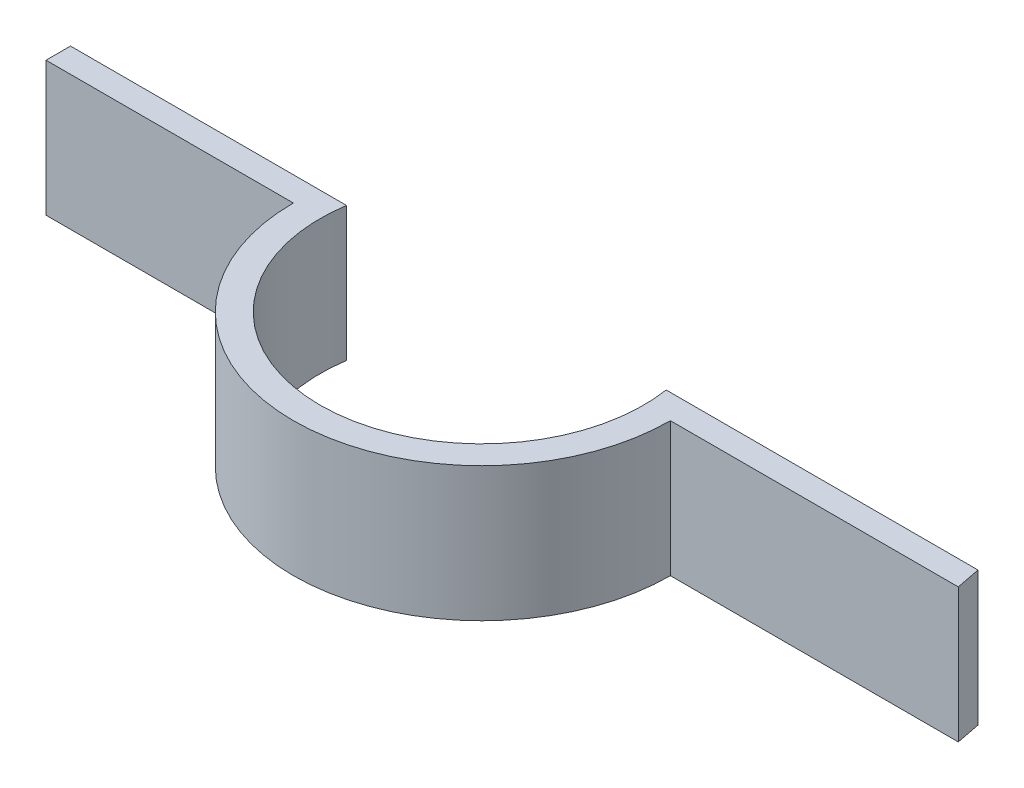
ISO-10303-21;
HEADER;
FILE_DESCRIPTION(('STEP AP214'),'2;1');
FILE_NAME('part.step','',(''),(''),'','','');
FILE_SCHEMA(('AUTOMOTIVE_DESIGN { 1 0 10303 214 1 1 1 1 }'));
ENDSEC;
DATA;
#1=APPLICATION_CONTEXT('core data for automotive mechanical design processes');
#2=APPLICATION_PROTOCOL_DEFINITION('international standard','automotive_design',2000,#1);
#3=PRODUCT_CONTEXT('',#1,'mechanical');
#4=PRODUCT('Part','Part','',(#3));
#5=PRODUCT_RELATED_PRODUCT_CATEGORY('part','',(#4));
#6=PRODUCT_DEFINITION_FORMATION('','',#4);
#7=PRODUCT_DEFINITION_CONTEXT('part definition',#1,'design');
#8=PRODUCT_DEFINITION('design','',#6,#7);
#9=PRODUCT_DEFINITION_SHAPE('','',#8);
#10=(LENGTH_UNIT() NAMED_UNIT(*) SI_UNIT(.MILLI.,.METRE.));
#11=(NAMED_UNIT(*) PLANE_ANGLE_UNIT() SI_UNIT($,.RADIAN.));
#12=(NAMED_UNIT(*) SI_UNIT($,.STERADIAN.) SOLID_ANGLE_UNIT());
#13=UNCERTAINTY_MEASURE_WITH_UNIT(LENGTH_MEASURE(1.E-05),#10,'distance_accuracy_value','');
#14=(GEOMETRIC_REPRESENTATION_CONTEXT(3) GLOBAL_UNCERTAINTY_ASSIGNED_CONTEXT((#13)) GLOBAL_UNIT_ASSIGNED_CONTEXT((#10,
#11,#12)) REPRESENTATION_CONTEXT('',''));
#15=CARTESIAN_POINT('',(0.,0.,0.));
#16=DIRECTION('',(0.,0.,1.));
#17=DIRECTION('',(1.,0.,0.));
#18=AXIS2_PLACEMENT_3D('',#15,#16,#17);
#19=CARTESIAN_POINT('',(0.,5.,0.));
#20=DIRECTION('',(0.,-1.,0.));
#21=DIRECTION('',(0.,0.,-1.));
#22=AXIS2_PLACEMENT_3D('',#19,#20,#21);
#23=CYLINDRICAL_SURFACE('',#22,7.01988505985517);
#24=CARTESIAN_POINT('',(0.,0.,0.));
#25=DIRECTION('',(0.,1.,0.));
#26=DIRECTION('',(0.,0.,1.));
#27=AXIS2_PLACEMENT_3D('',#24,#25,#26);
#28=CIRCLE('',#27,7.01988505985517);
#29=CARTESIAN_POINT('',(-7.01988505985517,0.,0.));
#30=VERTEX_POINT('',#29);
#31=CARTESIAN_POINT('',(7.01988505985517,0.,0.));
#32=VERTEX_POINT('',#31);
#33=EDGE_CURVE('E129',#30,#32,#28,.T.);
#34=ORIENTED_EDGE('',*,*,#33,.T.);
#35=DIRECTION('',(0.,-1.,0.));
#36=VECTOR('',#35,1.);
#37=CARTESIAN_POINT('',(7.01988505985517,5.,0.));
#38=LINE('',#37,#36);
#39=CARTESIAN_POINT('',(7.01988505985517,5.,0.));
#40=VERTEX_POINT('',#39);
#41=EDGE_CURVE('E11',#40,#32,#38,.T.);
#42=ORIENTED_EDGE('',*,*,#41,.F.);
#43=CARTESIAN_POINT('',(0.,5.,0.));
#44=DIRECTION('',(0.,1.,0.));
#45=DIRECTION('',(0.,0.,1.));
#46=AXIS2_PLACEMENT_3D('',#43,#44,#45);
#47=CIRCLE('',#46,7.01988505985517);
#48=CARTESIAN_POINT('',(-7.01988505985517,5.,0.));
#49=VERTEX_POINT('',#48);
#50=EDGE_CURVE('E143',#49,#40,#47,.T.);
#51=ORIENTED_EDGE('',*,*,#50,.F.);
#52=DIRECTION('',(0.,-1.,0.));
#53=VECTOR('',#52,1.);
#54=CARTESIAN_POINT('',(-7.01988505985517,5.,0.));
#55=LINE('',#54,#53);
#56=EDGE_CURVE('E125',#49,#30,#55,.T.);
#57=ORIENTED_EDGE('',*,*,#56,.T.);
#58=EDGE_LOOP('',(#34,#42,#51,#57));
#59=FACE_BOUND('',#58,.T.);
#60=ADVANCED_FACE('F33',(#59),#23,.T.);
#61=CARTESIAN_POINT('',(7.01988505985517,5.,0.));
#62=DIRECTION('',(0.,0.,-1.));
#63=DIRECTION('',(-1.,0.,0.));
#64=AXIS2_PLACEMENT_3D('',#61,#62,#63);
#65=PLANE('',#64);
#66=DIRECTION('',(1.,0.,0.));
#67=VECTOR('',#66,1.);
#68=CARTESIAN_POINT('',(7.01988505985517,0.,0.));
#69=LINE('',#68,#67);
#70=CARTESIAN_POINT('',(17.7415147410684,0.,0.));
#71=VERTEX_POINT('',#70);
#72=EDGE_CURVE('E132',#32,#71,#69,.T.);
#73=ORIENTED_EDGE('',*,*,#72,.T.);
#74=DIRECTION('',(0.,-1.,0.));
#75=VECTOR('',#74,1.);
#76=CARTESIAN_POINT('',(17.7415147410684,5.,0.));
#77=LINE('',#76,#75);
#78=CARTESIAN_POINT('',(17.7415147410684,5.,0.));
#79=VERTEX_POINT('',#78);
#80=EDGE_CURVE('E41',#79,#71,#77,.T.);
#81=ORIENTED_EDGE('',*,*,#80,.F.);
#82=DIRECTION('',(1.,0.,0.));
#83=VECTOR('',#82,1.);
#84=CARTESIAN_POINT('',(7.01988505985517,5.,0.));
#85=LINE('',#84,#83);
#86=EDGE_CURVE('E92',#40,#79,#85,.T.);
#87=ORIENTED_EDGE('',*,*,#86,.F.);
#88=ORIENTED_EDGE('',*,*,#41,.T.);
#89=EDGE_LOOP('',(#73,#81,#87,#88));
#90=FACE_BOUND('',#89,.T.);
#91=ADVANCED_FACE('F178',(#90),#65,.F.);
#92=CARTESIAN_POINT('',(17.7415147410684,5.,0.));
#93=DIRECTION('',(-0.981442077807243,0.,0.191758827461481));
#94=DIRECTION('',(0.191758827461481,0.,0.981442077807243));
#95=AXIS2_PLACEMENT_3D('',#92,#93,#94);
#96=PLANE('',#95);
#97=DIRECTION('',(-0.191758827461481,0.,-0.981442077807243));
#98=VECTOR('',#97,1.);
#99=CARTESIAN_POINT('',(17.7415147410684,0.,0.));
#100=LINE('',#99,#98);
#101=CARTESIAN_POINT('',(17.5632906491785,0.,-0.912169861358336));
#102=VERTEX_POINT('',#101);
#103=EDGE_CURVE('E134',#71,#102,#100,.T.);
#104=ORIENTED_EDGE('',*,*,#103,.T.);
#105=DIRECTION('',(0.,-1.,0.));
#106=VECTOR('',#105,1.);
#107=CARTESIAN_POINT('',(17.5632906491785,5.,-0.912169861358336));
#108=LINE('',#107,#106);
#109=CARTESIAN_POINT('',(17.5632906491785,5.,-0.912169861358336));
#110=VERTEX_POINT('',#109);
#111=EDGE_CURVE('E150',#110,#102,#108,.T.);
#112=ORIENTED_EDGE('',*,*,#111,.F.);
#113=DIRECTION('',(-0.191758827461481,0.,-0.981442077807243));
#114=VECTOR('',#113,1.);
#115=CARTESIAN_POINT('',(17.7415147410684,5.,0.));
#116=LINE('',#115,#114);
#117=EDGE_CURVE('E158',#79,#110,#116,.T.);
#118=ORIENTED_EDGE('',*,*,#117,.F.);
#119=ORIENTED_EDGE('',*,*,#80,.T.);
#120=EDGE_LOOP('',(#104,#112,#118,#119));
#121=FACE_BOUND('',#120,.T.);
#122=ADVANCED_FACE('F156',(#121),#96,.F.);
#123=CARTESIAN_POINT('',(17.5632906491785,5.,-0.912169861358336));
#124=DIRECTION('',(0.,0.,1.));
#125=DIRECTION('',(1.,0.,0.));
#126=AXIS2_PLACEMENT_3D('',#123,#124,#125);
#127=PLANE('',#126);
#128=DIRECTION('',(-1.,0.,0.));
#129=VECTOR('',#128,1.);
#130=CARTESIAN_POINT('',(17.5632906491785,0.,-0.912169861358336));
#131=LINE('',#130,#129);
#132=CARTESIAN_POINT('',(5.95193366137759,0.,-0.912169861358338));
#133=VERTEX_POINT('',#132);
#134=EDGE_CURVE('E136',#102,#133,#131,.T.);
#135=ORIENTED_EDGE('',*,*,#134,.T.);
#136=DIRECTION('',(0.,-1.,0.));
#137=VECTOR('',#136,1.);
#138=CARTESIAN_POINT('',(5.95193366137759,5.,-0.912169861358338));
#139=LINE('',#138,#137);
#140=CARTESIAN_POINT('',(5.95193366137759,5.,-0.912169861358338));
#141=VERTEX_POINT('',#140);
#142=EDGE_CURVE('E147',#141,#133,#139,.T.);
#143=ORIENTED_EDGE('',*,*,#142,.F.);
#144=DIRECTION('',(-1.,0.,0.));
#145=VECTOR('',#144,1.);
#146=CARTESIAN_POINT('',(17.5632906491785,5.,-0.912169861358336));
#147=LINE('',#146,#145);
#148=EDGE_CURVE('E170',#110,#141,#147,.T.);
#149=ORIENTED_EDGE('',*,*,#148,.F.);
#150=ORIENTED_EDGE('',*,*,#111,.T.);
#151=EDGE_LOOP('',(#135,#143,#149,#150));
#152=FACE_BOUND('',#151,.T.);
#153=ADVANCED_FACE('F166',(#152),#127,.F.);
#154=CARTESIAN_POINT('',(0.,5.,0.));
#155=DIRECTION('',(0.,-1.,0.));
#156=DIRECTION('',(0.,0.,-1.));
#157=AXIS2_PLACEMENT_3D('',#154,#155,#156);
#158=CYLINDRICAL_SURFACE('',#157,6.02142575852348);
#159=CARTESIAN_POINT('',(0.,0.,0.));
#160=DIRECTION('',(0.,-1.,0.));
#161=DIRECTION('',(0.,0.,1.));
#162=AXIS2_PLACEMENT_3D('',#159,#160,#161);
#163=CIRCLE('',#162,6.02142575852348);
#164=CARTESIAN_POINT('',(-5.95193366137759,0.,-0.912169861358336));
#165=VERTEX_POINT('',#164);
#166=EDGE_CURVE('E138',#133,#165,#163,.T.);
#167=ORIENTED_EDGE('',*,*,#166,.T.);
#168=DIRECTION('',(0.,-1.,0.));
#169=VECTOR('',#168,1.);
#170=CARTESIAN_POINT('',(-5.95193366137759,5.,-0.912169861358336));
#171=LINE('',#170,#169);
#172=CARTESIAN_POINT('',(-5.95193366137759,5.,-0.912169861358336));
#173=VERTEX_POINT('',#172);
#174=EDGE_CURVE('E120',#173,#165,#171,.T.);
#175=ORIENTED_EDGE('',*,*,#174,.F.);
#176=CARTESIAN_POINT('',(0.,5.,0.));
#177=DIRECTION('',(0.,-1.,0.));
#178=DIRECTION('',(0.,0.,1.));
#179=AXIS2_PLACEMENT_3D('',#176,#177,#178);
#180=CIRCLE('',#179,6.02142575852348);
#181=EDGE_CURVE('E111',#141,#173,#180,.T.);
#182=ORIENTED_EDGE('',*,*,#181,.F.);
#183=ORIENTED_EDGE('',*,*,#142,.T.);
#184=EDGE_LOOP('',(#167,#175,#182,#183));
#185=FACE_BOUND('',#184,.T.);
#186=ADVANCED_FACE('F169',(#185),#158,.F.);
#187=CARTESIAN_POINT('',(-16.2316726099974,5.,-0.912169861358336));
#188=DIRECTION('',(0.,0.,1.));
#189=DIRECTION('',(1.,0.,0.));
#190=AXIS2_PLACEMENT_3D('',#187,#188,#189);
#191=PLANE('',#190);
#192=DIRECTION('',(-1.,0.,0.));
#193=VECTOR('',#192,1.);
#194=CARTESIAN_POINT('',(-16.2316726099974,0.,-0.912169861358336));
#195=LINE('',#194,#193);
#196=CARTESIAN_POINT('',(-16.2316726099974,0.,-0.912169861358336));
#197=VERTEX_POINT('',#196);
#198=EDGE_CURVE('E119',#165,#197,#195,.T.);
#199=ORIENTED_EDGE('',*,*,#198,.T.);
#200=DIRECTION('',(0.,-1.,0.));
#201=VECTOR('',#200,1.);
#202=CARTESIAN_POINT('',(-16.2316726099974,5.,-0.912169861358336));
#203=LINE('',#202,#201);
#204=CARTESIAN_POINT('',(-16.2316726099974,5.,-0.912169861358336));
#205=VERTEX_POINT('',#204);
#206=EDGE_CURVE('E116',#205,#197,#203,.T.);
#207=ORIENTED_EDGE('',*,*,#206,.F.);
#208=DIRECTION('',(-1.,0.,0.));
#209=VECTOR('',#208,1.);
#210=CARTESIAN_POINT('',(-16.2316726099974,5.,-0.912169861358336));
#211=LINE('',#210,#209);
#212=EDGE_CURVE('E105',#173,#205,#211,.T.);
#213=ORIENTED_EDGE('',*,*,#212,.F.);
#214=ORIENTED_EDGE('',*,*,#174,.T.);
#215=EDGE_LOOP('',(#199,#207,#213,#214));
#216=FACE_BOUND('',#215,.T.);
#217=ADVANCED_FACE('F117',(#216),#191,.F.);
#218=CARTESIAN_POINT('',(-16.2316726099974,5.,0.));
#219=DIRECTION('',(1.,0.,0.));
#220=DIRECTION('',(0.,0.,-1.));
#221=AXIS2_PLACEMENT_3D('',#218,#219,#220);
#222=PLANE('',#221);
#223=DIRECTION('',(0.,0.,1.));
#224=VECTOR('',#223,1.);
#225=CARTESIAN_POINT('',(-16.2316726099974,0.,0.));
#226=LINE('',#225,#224);
#227=CARTESIAN_POINT('',(-16.2316726099974,0.,0.));
#228=VERTEX_POINT('',#227);
#229=EDGE_CURVE('E78',#197,#228,#226,.T.);
#230=ORIENTED_EDGE('',*,*,#229,.T.);
#231=DIRECTION('',(0.,-1.,0.));
#232=VECTOR('',#231,1.);
#233=CARTESIAN_POINT('',(-16.2316726099974,5.,0.));
#234=LINE('',#233,#232);
#235=CARTESIAN_POINT('',(-16.2316726099974,5.,0.));
#236=VERTEX_POINT('',#235);
#237=EDGE_CURVE('E121',#236,#228,#234,.T.);
#238=ORIENTED_EDGE('',*,*,#237,.F.);
#239=DIRECTION('',(0.,0.,1.));
#240=VECTOR('',#239,1.);
#241=CARTESIAN_POINT('',(-16.2316726099974,5.,0.));
#242=LINE('',#241,#240);
#243=EDGE_CURVE('E109',#205,#236,#242,.T.);
#244=ORIENTED_EDGE('',*,*,#243,.F.);
#245=ORIENTED_EDGE('',*,*,#206,.T.);
#246=EDGE_LOOP('',(#230,#238,#244,#245));
#247=FACE_BOUND('',#246,.T.);
#248=ADVANCED_FACE('F123',(#247),#222,.F.);
#249=CARTESIAN_POINT('',(-7.01988505985517,5.,0.));
#250=DIRECTION('',(0.,0.,-1.));
#251=DIRECTION('',(-1.,0.,0.));
#252=AXIS2_PLACEMENT_3D('',#249,#250,#251);
#253=PLANE('',#252);
#254=DIRECTION('',(1.,0.,0.));
#255=VECTOR('',#254,1.);
#256=CARTESIAN_POINT('',(-7.01988505985517,0.,0.));
#257=LINE('',#256,#255);
#258=EDGE_CURVE('E84',#228,#30,#257,.T.);
#259=ORIENTED_EDGE('',*,*,#258,.T.);
#260=ORIENTED_EDGE('',*,*,#56,.F.);
#261=DIRECTION('',(1.,0.,0.));
#262=VECTOR('',#261,1.);
#263=CARTESIAN_POINT('',(-7.01988505985517,5.,0.));
#264=LINE('',#263,#262);
#265=EDGE_CURVE('E49',#236,#49,#264,.T.);
#266=ORIENTED_EDGE('',*,*,#265,.F.);
#267=ORIENTED_EDGE('',*,*,#237,.T.);
#268=EDGE_LOOP('',(#259,#260,#266,#267));
#269=FACE_BOUND('',#268,.T.);
#270=ADVANCED_FACE('F194',(#269),#253,.F.);
#271=CARTESIAN_POINT('',(0.,5.,0.));
#272=DIRECTION('',(0.,1.,0.));
#273=DIRECTION('',(0.,0.,1.));
#274=AXIS2_PLACEMENT_3D('',#271,#272,#273);
#275=PLANE('',#274);
#276=ORIENTED_EDGE('',*,*,#50,.T.);
#277=ORIENTED_EDGE('',*,*,#86,.T.);
#278=ORIENTED_EDGE('',*,*,#117,.T.);
#279=ORIENTED_EDGE('',*,*,#148,.T.);
#280=ORIENTED_EDGE('',*,*,#181,.T.);
#281=ORIENTED_EDGE('',*,*,#212,.T.);
#282=ORIENTED_EDGE('',*,*,#243,.T.);
#283=ORIENTED_EDGE('',*,*,#265,.T.);
#284=EDGE_LOOP('',(#276,#277,#278,#279,#280,#281,#282,#283));
#285=FACE_BOUND('',#284,.T.);
#286=ADVANCED_FACE('F107',(#285),#275,.T.);
#287=CARTESIAN_POINT('',(0.,0.,0.));
#288=DIRECTION('',(0.,1.,0.));
#289=DIRECTION('',(0.,0.,1.));
#290=AXIS2_PLACEMENT_3D('',#287,#288,#289);
#291=PLANE('',#290);
#292=ORIENTED_EDGE('',*,*,#33,.F.);
#293=ORIENTED_EDGE('',*,*,#258,.F.);
#294=ORIENTED_EDGE('',*,*,#229,.F.);
#295=ORIENTED_EDGE('',*,*,#198,.F.);
#296=ORIENTED_EDGE('',*,*,#166,.F.);
#297=ORIENTED_EDGE('',*,*,#134,.F.);
#298=ORIENTED_EDGE('',*,*,#103,.F.);
#299=ORIENTED_EDGE('',*,*,#72,.F.);
#300=EDGE_LOOP('',(#292,#293,#294,#295,#296,#297,#298,#299));
#301=FACE_BOUND('',#300,.T.);
#302=ADVANCED_FACE('F162',(#301),#291,.F.);
#303=CLOSED_SHELL('',(#60,#91,#122,#153,#186,#217,#248,#270,#286,#302));
#304=MANIFOLD_SOLID_BREP('B2',#303);
#305=ADVANCED_BREP_SHAPE_REPRESENTATION('',(#18,#304),#14);
#306=SHAPE_DEFINITION_REPRESENTATION(#9,#305);
ENDSEC;
END-ISO-10303-21;
